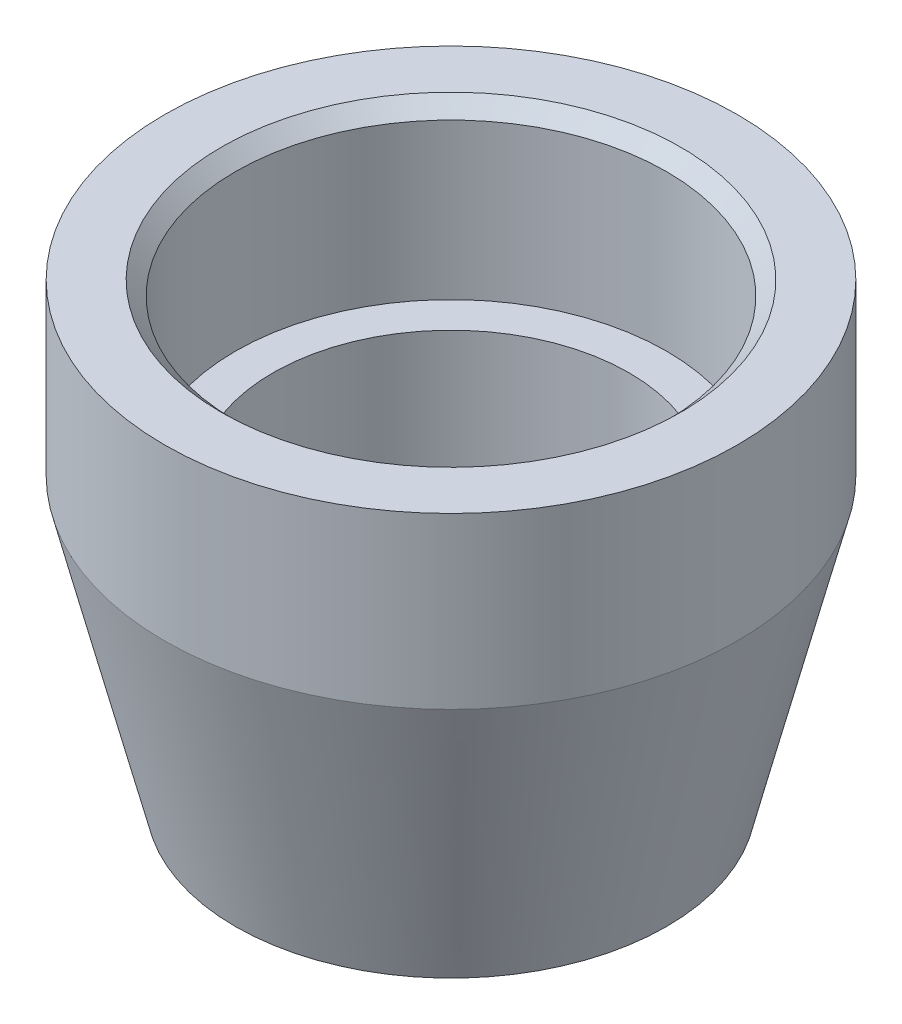
ISO-10303-21;
HEADER;
FILE_DESCRIPTION(('STEP AP214'),'2;1');
FILE_NAME('part.step','',(''),(''),'','','');
FILE_SCHEMA(('AUTOMOTIVE_DESIGN { 1 0 10303 214 1 1 1 1 }'));
ENDSEC;
DATA;
#1=APPLICATION_CONTEXT('core data for automotive mechanical design processes');
#2=APPLICATION_PROTOCOL_DEFINITION('international standard','automotive_design',2000,#1);
#3=PRODUCT_CONTEXT('',#1,'mechanical');
#4=PRODUCT('Part','Part','',(#3));
#5=PRODUCT_RELATED_PRODUCT_CATEGORY('part','',(#4));
#6=PRODUCT_DEFINITION_FORMATION('','',#4);
#7=PRODUCT_DEFINITION_CONTEXT('part definition',#1,'design');
#8=PRODUCT_DEFINITION('design','',#6,#7);
#9=PRODUCT_DEFINITION_SHAPE('','',#8);
#10=(LENGTH_UNIT() NAMED_UNIT(*) SI_UNIT(.MILLI.,.METRE.));
#11=(NAMED_UNIT(*) PLANE_ANGLE_UNIT() SI_UNIT($,.RADIAN.));
#12=(NAMED_UNIT(*) SI_UNIT($,.STERADIAN.) SOLID_ANGLE_UNIT());
#13=UNCERTAINTY_MEASURE_WITH_UNIT(LENGTH_MEASURE(1.E-05),#10,'distance_accuracy_value','');
#14=(GEOMETRIC_REPRESENTATION_CONTEXT(3) GLOBAL_UNCERTAINTY_ASSIGNED_CONTEXT((#13)) GLOBAL_UNIT_ASSIGNED_CONTEXT((#10,
#11,#12)) REPRESENTATION_CONTEXT('',''));
#15=CARTESIAN_POINT('',(0.,0.,0.));
#16=DIRECTION('',(0.,0.,1.));
#17=DIRECTION('',(1.,0.,0.));
#18=AXIS2_PLACEMENT_3D('',#15,#16,#17);
#19=CARTESIAN_POINT('',(3.05,0.,0.));
#20=DIRECTION('',(0.,-1.,0.));
#21=DIRECTION('',(0.,0.,-1.));
#22=AXIS2_PLACEMENT_3D('',#19,#20,#21);
#23=PLANE('',#22);
#24=CARTESIAN_POINT('',(0.,0.,0.));
#25=DIRECTION('',(0.,-1.,0.));
#26=DIRECTION('',(0.,0.,-1.));
#27=AXIS2_PLACEMENT_3D('',#24,#25,#26);
#28=CIRCLE('',#27,3.05);
#29=CARTESIAN_POINT('',(0.,0.,-3.05));
#30=VERTEX_POINT('',#29);
#31=EDGE_CURVE('E69',#30,#30,#28,.T.);
#32=ORIENTED_EDGE('',*,*,#31,.T.);
#33=EDGE_LOOP('',(#32));
#34=FACE_BOUND('',#33,.T.);
#35=CARTESIAN_POINT('',(0.,0.,0.));
#36=DIRECTION('',(0.,-1.,0.));
#37=DIRECTION('',(0.,0.,-1.));
#38=AXIS2_PLACEMENT_3D('',#35,#36,#37);
#39=CIRCLE('',#38,2.52);
#40=CARTESIAN_POINT('',(0.,0.,-2.52));
#41=VERTEX_POINT('',#40);
#42=EDGE_CURVE('E51',#41,#41,#39,.T.);
#43=ORIENTED_EDGE('',*,*,#42,.F.);
#44=EDGE_LOOP('',(#43));
#45=FACE_BOUND('',#44,.T.);
#46=ADVANCED_FACE('F39',(#34,#45),#23,.T.);
#47=CARTESIAN_POINT('',(0.,0.,0.));
#48=DIRECTION('',(0.,-1.,0.));
#49=DIRECTION('',(0.,0.,-1.));
#50=AXIS2_PLACEMENT_3D('',#47,#48,#49);
#51=CYLINDRICAL_SURFACE('',#50,2.52);
#52=ORIENTED_EDGE('',*,*,#42,.T.);
#53=EDGE_LOOP('',(#52));
#54=FACE_BOUND('',#53,.T.);
#55=CARTESIAN_POINT('',(0.,4.,0.));
#56=DIRECTION('',(0.,-1.,0.));
#57=DIRECTION('',(0.,0.,-1.));
#58=AXIS2_PLACEMENT_3D('',#55,#56,#57);
#59=CIRCLE('',#58,2.52);
#60=CARTESIAN_POINT('',(0.,4.,-2.52));
#61=VERTEX_POINT('',#60);
#62=EDGE_CURVE('E55',#61,#61,#59,.T.);
#63=ORIENTED_EDGE('',*,*,#62,.F.);
#64=EDGE_LOOP('',(#63));
#65=FACE_BOUND('',#64,.T.);
#66=ADVANCED_FACE('F90',(#54,#65),#51,.F.);
#67=CARTESIAN_POINT('',(2.52,4.,0.));
#68=DIRECTION('',(0.,1.,0.));
#69=DIRECTION('',(0.,0.,1.));
#70=AXIS2_PLACEMENT_3D('',#67,#68,#69);
#71=PLANE('',#70);
#72=ORIENTED_EDGE('',*,*,#62,.T.);
#73=EDGE_LOOP('',(#72));
#74=FACE_BOUND('',#73,.T.);
#75=CARTESIAN_POINT('',(0.,4.,0.));
#76=DIRECTION('',(0.,-1.,0.));
#77=DIRECTION('',(0.,0.,-1.));
#78=AXIS2_PLACEMENT_3D('',#75,#76,#77);
#79=CIRCLE('',#78,3.05);
#80=CARTESIAN_POINT('',(0.,4.,-3.05));
#81=VERTEX_POINT('',#80);
#82=EDGE_CURVE('E60',#81,#81,#79,.T.);
#83=ORIENTED_EDGE('',*,*,#82,.F.);
#84=EDGE_LOOP('',(#83));
#85=FACE_BOUND('',#84,.T.);
#86=ADVANCED_FACE('F94',(#74,#85),#71,.T.);
#87=CARTESIAN_POINT('',(0.,0.,0.));
#88=DIRECTION('',(0.,-1.,0.));
#89=DIRECTION('',(0.,0.,-1.));
#90=AXIS2_PLACEMENT_3D('',#87,#88,#89);
#91=CYLINDRICAL_SURFACE('',#90,3.05);
#92=CARTESIAN_POINT('',(0.,6.2,0.));
#93=DIRECTION('',(0.,1.,0.));
#94=DIRECTION('',(0.,0.,1.));
#95=AXIS2_PLACEMENT_3D('',#92,#93,#94);
#96=CIRCLE('',#95,3.05);
#97=CARTESIAN_POINT('',(0.,6.2,3.05));
#98=VERTEX_POINT('',#97);
#99=EDGE_CURVE('E10',#98,#98,#96,.T.);
#100=ORIENTED_EDGE('',*,*,#99,.T.);
#101=EDGE_LOOP('',(#100));
#102=FACE_BOUND('',#101,.T.);
#103=ORIENTED_EDGE('',*,*,#82,.T.);
#104=EDGE_LOOP('',(#103));
#105=FACE_BOUND('',#104,.T.);
#106=ADVANCED_FACE('F100',(#102,#105),#91,.F.);
#107=CARTESIAN_POINT('',(3.05,6.4,0.));
#108=DIRECTION('',(0.,1.,0.));
#109=DIRECTION('',(0.,0.,1.));
#110=AXIS2_PLACEMENT_3D('',#107,#108,#109);
#111=PLANE('',#110);
#112=CARTESIAN_POINT('',(0.,6.4,0.));
#113=DIRECTION('',(0.,1.,0.));
#114=DIRECTION('',(0.,0.,1.));
#115=AXIS2_PLACEMENT_3D('',#112,#113,#114);
#116=CIRCLE('',#115,3.25);
#117=CARTESIAN_POINT('',(0.,6.4,3.25));
#118=VERTEX_POINT('',#117);
#119=EDGE_CURVE('E47',#118,#118,#116,.F.);
#120=ORIENTED_EDGE('',*,*,#119,.T.);
#121=EDGE_LOOP('',(#120));
#122=FACE_BOUND('',#121,.T.);
#123=CARTESIAN_POINT('',(0.,6.4,0.));
#124=DIRECTION('',(0.,-1.,0.));
#125=DIRECTION('',(0.,0.,-1.));
#126=AXIS2_PLACEMENT_3D('',#123,#124,#125);
#127=CIRCLE('',#126,4.05);
#128=CARTESIAN_POINT('',(0.,6.4,-4.05));
#129=VERTEX_POINT('',#128);
#130=EDGE_CURVE('E63',#129,#129,#127,.T.);
#131=ORIENTED_EDGE('',*,*,#130,.F.);
#132=EDGE_LOOP('',(#131));
#133=FACE_BOUND('',#132,.T.);
#134=ADVANCED_FACE('F86',(#122,#133),#111,.T.);
#135=CARTESIAN_POINT('',(0.,0.,0.));
#136=DIRECTION('',(0.,-1.,0.));
#137=DIRECTION('',(0.,0.,-1.));
#138=AXIS2_PLACEMENT_3D('',#135,#136,#137);
#139=CYLINDRICAL_SURFACE('',#138,4.05);
#140=ORIENTED_EDGE('',*,*,#130,.T.);
#141=EDGE_LOOP('',(#140));
#142=FACE_BOUND('',#141,.T.);
#143=CARTESIAN_POINT('',(0.,4.,0.));
#144=DIRECTION('',(0.,-1.,0.));
#145=DIRECTION('',(0.,0.,-1.));
#146=AXIS2_PLACEMENT_3D('',#143,#144,#145);
#147=CIRCLE('',#146,4.05);
#148=CARTESIAN_POINT('',(0.,4.,-4.05));
#149=VERTEX_POINT('',#148);
#150=EDGE_CURVE('E66',#149,#149,#147,.T.);
#151=ORIENTED_EDGE('',*,*,#150,.F.);
#152=EDGE_LOOP('',(#151));
#153=FACE_BOUND('',#152,.T.);
#154=ADVANCED_FACE('F77',(#142,#153),#139,.T.);
#155=CARTESIAN_POINT('',(0.,0.,0.));
#156=DIRECTION('',(0.,1.,0.));
#157=DIRECTION('',(0.,0.,1.));
#158=AXIS2_PLACEMENT_3D('',#155,#156,#157);
#159=CONICAL_SURFACE('',#158,3.05,0.244978663126864);
#160=ORIENTED_EDGE('',*,*,#150,.T.);
#161=EDGE_LOOP('',(#160));
#162=FACE_BOUND('',#161,.T.);
#163=ORIENTED_EDGE('',*,*,#31,.F.);
#164=EDGE_LOOP('',(#163));
#165=FACE_BOUND('',#164,.T.);
#166=ADVANCED_FACE('F75',(#162,#165),#159,.T.);
#167=CARTESIAN_POINT('',(0.,6.4,0.));
#168=DIRECTION('',(0.,1.,0.));
#169=DIRECTION('',(0.,0.,1.));
#170=AXIS2_PLACEMENT_3D('',#167,#168,#169);
#171=CONICAL_SURFACE('',#170,3.25,0.785398163397455);
#172=ORIENTED_EDGE('',*,*,#99,.F.);
#173=EDGE_LOOP('',(#172));
#174=FACE_BOUND('',#173,.T.);
#175=ORIENTED_EDGE('',*,*,#119,.F.);
#176=EDGE_LOOP('',(#175));
#177=FACE_BOUND('',#176,.T.);
#178=ADVANCED_FACE('F42',(#174,#177),#171,.F.);
#179=CLOSED_SHELL('',(#46,#66,#86,#106,#134,#154,#166,#178));
#180=MANIFOLD_SOLID_BREP('B2',#179);
#181=ADVANCED_BREP_SHAPE_REPRESENTATION('',(#18,#180),#14);
#182=SHAPE_DEFINITION_REPRESENTATION(#9,#181);
ENDSEC;
END-ISO-10303-21;
